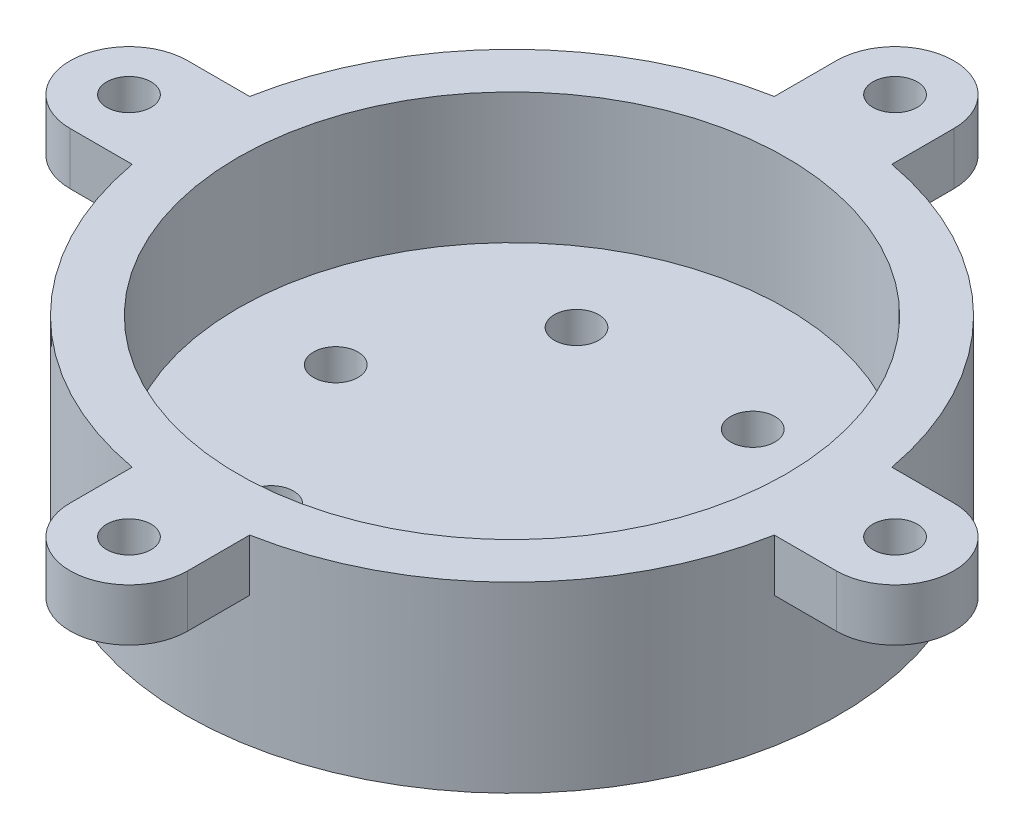
ISO-10303-21;
HEADER;
FILE_DESCRIPTION(('STEP AP214'),'2;1');
FILE_NAME('part.step','',(''),(''),'','','');
FILE_SCHEMA(('AUTOMOTIVE_DESIGN { 1 0 10303 214 1 1 1 1 }'));
ENDSEC;
DATA;
#1=APPLICATION_CONTEXT('core data for automotive mechanical design processes');
#2=APPLICATION_PROTOCOL_DEFINITION('international standard','automotive_design',2000,#1);
#3=PRODUCT_CONTEXT('',#1,'mechanical');
#4=PRODUCT('Part','Part','',(#3));
#5=PRODUCT_RELATED_PRODUCT_CATEGORY('part','',(#4));
#6=PRODUCT_DEFINITION_FORMATION('','',#4);
#7=PRODUCT_DEFINITION_CONTEXT('part definition',#1,'design');
#8=PRODUCT_DEFINITION('design','',#6,#7);
#9=PRODUCT_DEFINITION_SHAPE('','',#8);
#10=(LENGTH_UNIT() NAMED_UNIT(*) SI_UNIT(.MILLI.,.METRE.));
#11=(NAMED_UNIT(*) PLANE_ANGLE_UNIT() SI_UNIT($,.RADIAN.));
#12=(NAMED_UNIT(*) SI_UNIT($,.STERADIAN.) SOLID_ANGLE_UNIT());
#13=UNCERTAINTY_MEASURE_WITH_UNIT(LENGTH_MEASURE(1.E-05),#10,'distance_accuracy_value','');
#14=(GEOMETRIC_REPRESENTATION_CONTEXT(3) GLOBAL_UNCERTAINTY_ASSIGNED_CONTEXT((#13)) GLOBAL_UNIT_ASSIGNED_CONTEXT((#10,
#11,#12)) REPRESENTATION_CONTEXT('',''));
#15=CARTESIAN_POINT('',(0.,0.,0.));
#16=DIRECTION('',(0.,0.,1.));
#17=DIRECTION('',(1.,0.,0.));
#18=AXIS2_PLACEMENT_3D('',#15,#16,#17);
#19=CARTESIAN_POINT('',(0.,6.,0.));
#20=DIRECTION('',(0.,1.,0.));
#21=DIRECTION('',(0.,0.,1.));
#22=AXIS2_PLACEMENT_3D('',#19,#20,#21);
#23=PLANE('',#22);
#24=CARTESIAN_POINT('',(0.,6.,-29.34));
#25=DIRECTION('',(0.,1.,0.));
#26=DIRECTION('',(0.,0.,1.));
#27=AXIS2_PLACEMENT_3D('',#24,#25,#26);
#28=CIRCLE('',#27,4.5);
#29=CARTESIAN_POINT('',(-4.50000000000001,6.,-29.34));
#30=VERTEX_POINT('',#29);
#31=CARTESIAN_POINT('',(4.5,6.,-29.34));
#32=VERTEX_POINT('',#31);
#33=EDGE_CURVE('E234',#30,#32,#28,.F.);
#34=ORIENTED_EDGE('',*,*,#33,.T.);
#35=DIRECTION('',(0.,0.,1.));
#36=VECTOR('',#35,1.);
#37=CARTESIAN_POINT('',(4.5,6.,0.));
#38=LINE('',#37,#36);
#39=CARTESIAN_POINT('',(4.5,6.,-24.5916652547159));
#40=VERTEX_POINT('',#39);
#41=EDGE_CURVE('E242',#32,#40,#38,.T.);
#42=ORIENTED_EDGE('',*,*,#41,.T.);
#43=CARTESIAN_POINT('',(0.,6.,0.));
#44=DIRECTION('',(0.,1.,0.));
#45=DIRECTION('',(0.,0.,1.));
#46=AXIS2_PLACEMENT_3D('',#43,#44,#45);
#47=CIRCLE('',#46,25.);
#48=CARTESIAN_POINT('',(-4.5,6.,-24.5916652547159));
#49=VERTEX_POINT('',#48);
#50=EDGE_CURVE('E240',#40,#49,#47,.T.);
#51=ORIENTED_EDGE('',*,*,#50,.T.);
#52=DIRECTION('',(0.,0.,-1.));
#53=VECTOR('',#52,1.);
#54=CARTESIAN_POINT('',(-4.5,6.,0.));
#55=LINE('',#54,#53);
#56=EDGE_CURVE('E237',#49,#30,#55,.T.);
#57=ORIENTED_EDGE('',*,*,#56,.T.);
#58=EDGE_LOOP('',(#34,#42,#51,#57));
#59=FACE_BOUND('',#58,.T.);
#60=CARTESIAN_POINT('',(0.,6.,-29.34));
#61=DIRECTION('',(0.,-1.,0.));
#62=DIRECTION('',(0.,0.,-1.));
#63=AXIS2_PLACEMENT_3D('',#60,#61,#62);
#64=CIRCLE('',#63,1.725);
#65=CARTESIAN_POINT('',(0.,6.,-31.065));
#66=VERTEX_POINT('',#65);
#67=EDGE_CURVE('E724',#66,#66,#64,.T.);
#68=ORIENTED_EDGE('',*,*,#67,.F.);
#69=EDGE_LOOP('',(#68));
#70=FACE_BOUND('',#69,.T.);
#71=ADVANCED_FACE('F51',(#59,#70),#23,.F.);
#72=CARTESIAN_POINT('',(0.,6.,0.));
#73=DIRECTION('',(0.,1.,0.));
#74=DIRECTION('',(0.,0.,1.));
#75=AXIS2_PLACEMENT_3D('',#72,#73,#74);
#76=PLANE('',#75);
#77=CARTESIAN_POINT('',(0.,6.,0.));
#78=DIRECTION('',(0.,1.,0.));
#79=DIRECTION('',(0.,0.,1.));
#80=AXIS2_PLACEMENT_3D('',#77,#78,#79);
#81=CIRCLE('',#80,25.);
#82=CARTESIAN_POINT('',(-24.5916652547159,6.,-4.5));
#83=VERTEX_POINT('',#82);
#84=CARTESIAN_POINT('',(-24.5916652547159,6.,4.5));
#85=VERTEX_POINT('',#84);
#86=EDGE_CURVE('E170',#83,#85,#81,.T.);
#87=ORIENTED_EDGE('',*,*,#86,.T.);
#88=DIRECTION('',(-1.,0.,0.));
#89=VECTOR('',#88,1.);
#90=CARTESIAN_POINT('',(0.,6.,4.49999999999999));
#91=LINE('',#90,#89);
#92=CARTESIAN_POINT('',(-29.34,6.,4.5));
#93=VERTEX_POINT('',#92);
#94=EDGE_CURVE('E186',#85,#93,#91,.T.);
#95=ORIENTED_EDGE('',*,*,#94,.T.);
#96=CARTESIAN_POINT('',(-29.34,6.,0.));
#97=DIRECTION('',(0.,1.,0.));
#98=DIRECTION('',(0.,0.,1.));
#99=AXIS2_PLACEMENT_3D('',#96,#97,#98);
#100=CIRCLE('',#99,4.5);
#101=CARTESIAN_POINT('',(-29.34,6.,-4.5));
#102=VERTEX_POINT('',#101);
#103=EDGE_CURVE('E172',#93,#102,#100,.F.);
#104=ORIENTED_EDGE('',*,*,#103,.T.);
#105=DIRECTION('',(1.,0.,0.));
#106=VECTOR('',#105,1.);
#107=CARTESIAN_POINT('',(0.,6.,-4.5));
#108=LINE('',#107,#106);
#109=EDGE_CURVE('E165',#102,#83,#108,.T.);
#110=ORIENTED_EDGE('',*,*,#109,.T.);
#111=EDGE_LOOP('',(#87,#95,#104,#110));
#112=FACE_BOUND('',#111,.T.);
#113=CARTESIAN_POINT('',(-29.34,6.,0.));
#114=DIRECTION('',(0.,-1.,0.));
#115=DIRECTION('',(0.,0.,-1.));
#116=AXIS2_PLACEMENT_3D('',#113,#114,#115);
#117=CIRCLE('',#116,1.725);
#118=CARTESIAN_POINT('',(-29.34,6.,-1.725));
#119=VERTEX_POINT('',#118);
#120=EDGE_CURVE('E731',#119,#119,#117,.T.);
#121=ORIENTED_EDGE('',*,*,#120,.F.);
#122=EDGE_LOOP('',(#121));
#123=FACE_BOUND('',#122,.T.);
#124=ADVANCED_FACE('F167',(#112,#123),#76,.F.);
#125=CARTESIAN_POINT('',(0.,6.,0.));
#126=DIRECTION('',(0.,1.,0.));
#127=DIRECTION('',(0.,0.,1.));
#128=AXIS2_PLACEMENT_3D('',#125,#126,#127);
#129=PLANE('',#128);
#130=CARTESIAN_POINT('',(0.,6.,29.34));
#131=DIRECTION('',(0.,1.,0.));
#132=DIRECTION('',(0.,0.,1.));
#133=AXIS2_PLACEMENT_3D('',#130,#131,#132);
#134=CIRCLE('',#133,4.5);
#135=CARTESIAN_POINT('',(4.5,6.,29.34));
#136=VERTEX_POINT('',#135);
#137=CARTESIAN_POINT('',(-4.5,6.,29.34));
#138=VERTEX_POINT('',#137);
#139=EDGE_CURVE('E207',#136,#138,#134,.F.);
#140=ORIENTED_EDGE('',*,*,#139,.T.);
#141=DIRECTION('',(0.,0.,-1.));
#142=VECTOR('',#141,1.);
#143=CARTESIAN_POINT('',(-4.49999999999999,6.,0.));
#144=LINE('',#143,#142);
#145=CARTESIAN_POINT('',(-4.5,6.,24.5916652547159));
#146=VERTEX_POINT('',#145);
#147=EDGE_CURVE('E215',#138,#146,#144,.T.);
#148=ORIENTED_EDGE('',*,*,#147,.T.);
#149=CARTESIAN_POINT('',(0.,6.,0.));
#150=DIRECTION('',(0.,1.,0.));
#151=DIRECTION('',(0.,0.,1.));
#152=AXIS2_PLACEMENT_3D('',#149,#150,#151);
#153=CIRCLE('',#152,25.);
#154=CARTESIAN_POINT('',(4.5,6.,24.5916652547159));
#155=VERTEX_POINT('',#154);
#156=EDGE_CURVE('E213',#146,#155,#153,.T.);
#157=ORIENTED_EDGE('',*,*,#156,.T.);
#158=DIRECTION('',(0.,0.,1.));
#159=VECTOR('',#158,1.);
#160=CARTESIAN_POINT('',(4.5,6.,0.));
#161=LINE('',#160,#159);
#162=EDGE_CURVE('E210',#155,#136,#161,.T.);
#163=ORIENTED_EDGE('',*,*,#162,.T.);
#164=EDGE_LOOP('',(#140,#148,#157,#163));
#165=FACE_BOUND('',#164,.T.);
#166=CARTESIAN_POINT('',(0.,6.,29.34));
#167=DIRECTION('',(0.,-1.,0.));
#168=DIRECTION('',(0.,0.,-1.));
#169=AXIS2_PLACEMENT_3D('',#166,#167,#168);
#170=CIRCLE('',#169,1.725);
#171=CARTESIAN_POINT('',(0.,6.,27.615));
#172=VERTEX_POINT('',#171);
#173=EDGE_CURVE('E740',#172,#172,#170,.T.);
#174=ORIENTED_EDGE('',*,*,#173,.F.);
#175=EDGE_LOOP('',(#174));
#176=FACE_BOUND('',#175,.T.);
#177=ADVANCED_FACE('F323',(#165,#176),#129,.F.);
#178=CARTESIAN_POINT('',(0.,6.,0.));
#179=DIRECTION('',(0.,1.,0.));
#180=DIRECTION('',(0.,0.,1.));
#181=AXIS2_PLACEMENT_3D('',#178,#179,#180);
#182=PLANE('',#181);
#183=CARTESIAN_POINT('',(29.34,6.,0.));
#184=DIRECTION('',(0.,1.,0.));
#185=DIRECTION('',(0.,0.,1.));
#186=AXIS2_PLACEMENT_3D('',#183,#184,#185);
#187=CIRCLE('',#186,4.5);
#188=CARTESIAN_POINT('',(29.34,6.,-4.5));
#189=VERTEX_POINT('',#188);
#190=CARTESIAN_POINT('',(29.34,6.,4.5));
#191=VERTEX_POINT('',#190);
#192=EDGE_CURVE('E262',#189,#191,#187,.F.);
#193=ORIENTED_EDGE('',*,*,#192,.T.);
#194=DIRECTION('',(-1.,0.,0.));
#195=VECTOR('',#194,1.);
#196=CARTESIAN_POINT('',(0.,6.,4.5));
#197=LINE('',#196,#195);
#198=CARTESIAN_POINT('',(24.5916652547159,6.,4.5));
#199=VERTEX_POINT('',#198);
#200=EDGE_CURVE('E270',#191,#199,#197,.T.);
#201=ORIENTED_EDGE('',*,*,#200,.T.);
#202=CARTESIAN_POINT('',(0.,6.,0.));
#203=DIRECTION('',(0.,1.,0.));
#204=DIRECTION('',(0.,0.,1.));
#205=AXIS2_PLACEMENT_3D('',#202,#203,#204);
#206=CIRCLE('',#205,25.);
#207=CARTESIAN_POINT('',(24.5916652547159,6.,-4.5));
#208=VERTEX_POINT('',#207);
#209=EDGE_CURVE('E268',#199,#208,#206,.T.);
#210=ORIENTED_EDGE('',*,*,#209,.T.);
#211=DIRECTION('',(1.,0.,0.));
#212=VECTOR('',#211,1.);
#213=CARTESIAN_POINT('',(0.,6.,-4.5));
#214=LINE('',#213,#212);
#215=EDGE_CURVE('E265',#208,#189,#214,.T.);
#216=ORIENTED_EDGE('',*,*,#215,.T.);
#217=EDGE_LOOP('',(#193,#201,#210,#216));
#218=FACE_BOUND('',#217,.T.);
#219=CARTESIAN_POINT('',(29.34,6.,0.));
#220=DIRECTION('',(0.,-1.,0.));
#221=DIRECTION('',(0.,0.,-1.));
#222=AXIS2_PLACEMENT_3D('',#219,#220,#221);
#223=CIRCLE('',#222,1.725);
#224=CARTESIAN_POINT('',(29.34,6.,-1.725));
#225=VERTEX_POINT('',#224);
#226=EDGE_CURVE('E474',#225,#225,#223,.T.);
#227=ORIENTED_EDGE('',*,*,#226,.F.);
#228=EDGE_LOOP('',(#227));
#229=FACE_BOUND('',#228,.T.);
#230=ADVANCED_FACE('F343',(#218,#229),#182,.F.);
#231=CARTESIAN_POINT('',(0.,-4.,0.));
#232=DIRECTION('',(0.,1.,0.));
#233=DIRECTION('',(0.,0.,1.));
#234=AXIS2_PLACEMENT_3D('',#231,#232,#233);
#235=PLANE('',#234);
#236=CARTESIAN_POINT('',(-6.75000000000014,-4.,-11.6913429510898));
#237=DIRECTION('',(0.,-1.,0.));
#238=DIRECTION('',(0.,0.,-1.));
#239=AXIS2_PLACEMENT_3D('',#236,#237,#238);
#240=CIRCLE('',#239,1.725);
#241=CARTESIAN_POINT('',(-6.75000000000014,-4.,-13.4163429510898));
#242=VERTEX_POINT('',#241);
#243=EDGE_CURVE('E367',#242,#242,#240,.T.);
#244=ORIENTED_EDGE('',*,*,#243,.F.);
#245=EDGE_LOOP('',(#244));
#246=FACE_BOUND('',#245,.T.);
#247=CARTESIAN_POINT('',(6.74999999999989,-4.,-11.69134295109));
#248=DIRECTION('',(0.,-1.,0.));
#249=DIRECTION('',(0.,0.,-1.));
#250=AXIS2_PLACEMENT_3D('',#247,#248,#249);
#251=CIRCLE('',#250,1.725);
#252=CARTESIAN_POINT('',(6.74999999999989,-4.,-13.41634295109));
#253=VERTEX_POINT('',#252);
#254=EDGE_CURVE('E371',#253,#253,#251,.T.);
#255=ORIENTED_EDGE('',*,*,#254,.F.);
#256=EDGE_LOOP('',(#255));
#257=FACE_BOUND('',#256,.T.);
#258=CARTESIAN_POINT('',(13.5,-4.,0.));
#259=DIRECTION('',(0.,-1.,0.));
#260=DIRECTION('',(0.,0.,-1.));
#261=AXIS2_PLACEMENT_3D('',#258,#259,#260);
#262=CIRCLE('',#261,1.725);
#263=CARTESIAN_POINT('',(13.5,-4.,-1.725));
#264=VERTEX_POINT('',#263);
#265=EDGE_CURVE('E375',#264,#264,#262,.T.);
#266=ORIENTED_EDGE('',*,*,#265,.F.);
#267=EDGE_LOOP('',(#266));
#268=FACE_BOUND('',#267,.T.);
#269=CARTESIAN_POINT('',(6.75000000000006,-4.,11.6913429510899));
#270=DIRECTION('',(0.,-1.,0.));
#271=DIRECTION('',(0.,0.,-1.));
#272=AXIS2_PLACEMENT_3D('',#269,#270,#271);
#273=CIRCLE('',#272,1.725);
#274=CARTESIAN_POINT('',(6.75000000000006,-4.,9.96634295108989));
#275=VERTEX_POINT('',#274);
#276=EDGE_CURVE('E379',#275,#275,#273,.T.);
#277=ORIENTED_EDGE('',*,*,#276,.F.);
#278=EDGE_LOOP('',(#277));
#279=FACE_BOUND('',#278,.T.);
#280=CARTESIAN_POINT('',(-13.5,-4.,0.));
#281=DIRECTION('',(0.,-1.,0.));
#282=DIRECTION('',(0.,0.,-1.));
#283=AXIS2_PLACEMENT_3D('',#280,#281,#282);
#284=CIRCLE('',#283,1.725);
#285=CARTESIAN_POINT('',(-13.5,-4.,-1.725));
#286=VERTEX_POINT('',#285);
#287=EDGE_CURVE('E383',#286,#286,#284,.T.);
#288=ORIENTED_EDGE('',*,*,#287,.F.);
#289=EDGE_LOOP('',(#288));
#290=FACE_BOUND('',#289,.T.);
#291=CARTESIAN_POINT('',(0.,-4.,0.));
#292=DIRECTION('',(0.,1.,0.));
#293=DIRECTION('',(0.,0.,1.));
#294=AXIS2_PLACEMENT_3D('',#291,#292,#293);
#295=CIRCLE('',#294,25.);
#296=CARTESIAN_POINT('',(0.,-4.,25.));
#297=VERTEX_POINT('',#296);
#298=EDGE_CURVE('E282',#297,#297,#295,.T.);
#299=ORIENTED_EDGE('',*,*,#298,.F.);
#300=EDGE_LOOP('',(#299));
#301=FACE_BOUND('',#300,.T.);
#302=CARTESIAN_POINT('',(-6.74999999999997,-4.,11.6913429510899));
#303=DIRECTION('',(0.,-1.,0.));
#304=DIRECTION('',(0.,0.,-1.));
#305=AXIS2_PLACEMENT_3D('',#302,#303,#304);
#306=CIRCLE('',#305,1.725);
#307=CARTESIAN_POINT('',(-6.74999999999997,-4.,9.96634295108994));
#308=VERTEX_POINT('',#307);
#309=EDGE_CURVE('E388',#308,#308,#306,.T.);
#310=ORIENTED_EDGE('',*,*,#309,.F.);
#311=EDGE_LOOP('',(#310));
#312=FACE_BOUND('',#311,.T.);
#313=ADVANCED_FACE('F346',(#246,#257,#268,#279,#290,#301,#312),#235,.F.);
#314=CARTESIAN_POINT('',(0.,10.,0.));
#315=DIRECTION('',(0.,-1.,0.));
#316=DIRECTION('',(0.,0.,-1.));
#317=AXIS2_PLACEMENT_3D('',#314,#315,#316);
#318=CYLINDRICAL_SURFACE('',#317,25.);
#319=ORIENTED_EDGE('',*,*,#298,.T.);
#320=EDGE_LOOP('',(#319));
#321=FACE_BOUND('',#320,.T.);
#322=DIRECTION('',(0.,1.,0.));
#323=VECTOR('',#322,1.);
#324=CARTESIAN_POINT('',(-24.5916652547159,6.,4.5));
#325=LINE('',#324,#323);
#326=CARTESIAN_POINT('',(-24.5916652547159,10.,4.5));
#327=VERTEX_POINT('',#326);
#328=EDGE_CURVE('E67',#85,#327,#325,.T.);
#329=ORIENTED_EDGE('',*,*,#328,.F.);
#330=ORIENTED_EDGE('',*,*,#86,.F.);
#331=DIRECTION('',(0.,1.,0.));
#332=VECTOR('',#331,1.);
#333=CARTESIAN_POINT('',(-24.5916652547159,6.,-4.5));
#334=LINE('',#333,#332);
#335=CARTESIAN_POINT('',(-24.5916652547159,10.,-4.5));
#336=VERTEX_POINT('',#335);
#337=EDGE_CURVE('E178',#83,#336,#334,.T.);
#338=ORIENTED_EDGE('',*,*,#337,.T.);
#339=CARTESIAN_POINT('',(0.,10.,0.));
#340=DIRECTION('',(0.,1.,0.));
#341=DIRECTION('',(0.,0.,1.));
#342=AXIS2_PLACEMENT_3D('',#339,#340,#341);
#343=CIRCLE('',#342,25.);
#344=CARTESIAN_POINT('',(-4.5,10.,-24.5916652547159));
#345=VERTEX_POINT('',#344);
#346=EDGE_CURVE('E59',#345,#336,#343,.T.);
#347=ORIENTED_EDGE('',*,*,#346,.F.);
#348=DIRECTION('',(0.,1.,0.));
#349=VECTOR('',#348,1.);
#350=CARTESIAN_POINT('',(-4.5,6.,-24.5916652547159));
#351=LINE('',#350,#349);
#352=EDGE_CURVE('E257',#49,#345,#351,.T.);
#353=ORIENTED_EDGE('',*,*,#352,.F.);
#354=ORIENTED_EDGE('',*,*,#50,.F.);
#355=DIRECTION('',(0.,1.,0.));
#356=VECTOR('',#355,1.);
#357=CARTESIAN_POINT('',(4.5,6.,-24.5916652547159));
#358=LINE('',#357,#356);
#359=CARTESIAN_POINT('',(4.5,10.,-24.5916652547159));
#360=VERTEX_POINT('',#359);
#361=EDGE_CURVE('E254',#40,#360,#358,.T.);
#362=ORIENTED_EDGE('',*,*,#361,.T.);
#363=CARTESIAN_POINT('',(24.5916652547159,10.,-4.5));
#364=VERTEX_POINT('',#363);
#365=EDGE_CURVE('E12',#364,#360,#343,.T.);
#366=ORIENTED_EDGE('',*,*,#365,.F.);
#367=DIRECTION('',(0.,1.,0.));
#368=VECTOR('',#367,1.);
#369=CARTESIAN_POINT('',(24.5916652547159,6.,-4.5));
#370=LINE('',#369,#368);
#371=EDGE_CURVE('E286',#208,#364,#370,.T.);
#372=ORIENTED_EDGE('',*,*,#371,.F.);
#373=ORIENTED_EDGE('',*,*,#209,.F.);
#374=DIRECTION('',(0.,1.,0.));
#375=VECTOR('',#374,1.);
#376=CARTESIAN_POINT('',(24.5916652547159,6.,4.5));
#377=LINE('',#376,#375);
#378=CARTESIAN_POINT('',(24.5916652547159,10.,4.5));
#379=VERTEX_POINT('',#378);
#380=EDGE_CURVE('E283',#199,#379,#377,.T.);
#381=ORIENTED_EDGE('',*,*,#380,.T.);
#382=CARTESIAN_POINT('',(4.5,10.,24.5916652547159));
#383=VERTEX_POINT('',#382);
#384=EDGE_CURVE('E296',#383,#379,#343,.T.);
#385=ORIENTED_EDGE('',*,*,#384,.F.);
#386=DIRECTION('',(0.,1.,0.));
#387=VECTOR('',#386,1.);
#388=CARTESIAN_POINT('',(4.5,6.,24.5916652547159));
#389=LINE('',#388,#387);
#390=EDGE_CURVE('E230',#155,#383,#389,.T.);
#391=ORIENTED_EDGE('',*,*,#390,.F.);
#392=ORIENTED_EDGE('',*,*,#156,.F.);
#393=DIRECTION('',(0.,1.,0.));
#394=VECTOR('',#393,1.);
#395=CARTESIAN_POINT('',(-4.5,6.,24.5916652547159));
#396=LINE('',#395,#394);
#397=CARTESIAN_POINT('',(-4.5,10.,24.5916652547159));
#398=VERTEX_POINT('',#397);
#399=EDGE_CURVE('E227',#146,#398,#396,.T.);
#400=ORIENTED_EDGE('',*,*,#399,.T.);
#401=EDGE_CURVE('E60',#327,#398,#343,.T.);
#402=ORIENTED_EDGE('',*,*,#401,.F.);
#403=EDGE_LOOP('',(#329,#330,#338,#347,#353,#354,#362,#366,#372,#373,#381,#385,#391,#392,#400,#402));
#404=FACE_BOUND('',#403,.T.);
#405=ADVANCED_FACE('F53',(#321,#404),#318,.T.);
#406=CARTESIAN_POINT('',(0.,10.,0.));
#407=DIRECTION('',(0.,1.,0.));
#408=DIRECTION('',(0.,0.,1.));
#409=AXIS2_PLACEMENT_3D('',#406,#407,#408);
#410=PLANE('',#409);
#411=CARTESIAN_POINT('',(0.,10.,-29.34));
#412=DIRECTION('',(0.,1.,0.));
#413=DIRECTION('',(0.,0.,1.));
#414=AXIS2_PLACEMENT_3D('',#411,#412,#413);
#415=CIRCLE('',#414,1.69999999999999);
#416=CARTESIAN_POINT('',(0.,10.,-27.64));
#417=VERTEX_POINT('',#416);
#418=EDGE_CURVE('E726',#417,#417,#415,.T.);
#419=ORIENTED_EDGE('',*,*,#418,.F.);
#420=EDGE_LOOP('',(#419));
#421=FACE_BOUND('',#420,.T.);
#422=CARTESIAN_POINT('',(-29.34,10.,0.));
#423=DIRECTION('',(0.,1.,0.));
#424=DIRECTION('',(0.,0.,1.));
#425=AXIS2_PLACEMENT_3D('',#422,#423,#424);
#426=CIRCLE('',#425,1.69999999999999);
#427=CARTESIAN_POINT('',(-29.34,10.,1.7));
#428=VERTEX_POINT('',#427);
#429=EDGE_CURVE('E737',#428,#428,#426,.T.);
#430=ORIENTED_EDGE('',*,*,#429,.F.);
#431=EDGE_LOOP('',(#430));
#432=FACE_BOUND('',#431,.T.);
#433=CARTESIAN_POINT('',(0.,10.,29.34));
#434=DIRECTION('',(0.,1.,0.));
#435=DIRECTION('',(0.,0.,1.));
#436=AXIS2_PLACEMENT_3D('',#433,#434,#435);
#437=CIRCLE('',#436,1.69999999999999);
#438=CARTESIAN_POINT('',(0.,10.,31.04));
#439=VERTEX_POINT('',#438);
#440=EDGE_CURVE('E477',#439,#439,#437,.T.);
#441=ORIENTED_EDGE('',*,*,#440,.F.);
#442=EDGE_LOOP('',(#441));
#443=FACE_BOUND('',#442,.T.);
#444=CARTESIAN_POINT('',(29.34,10.,0.));
#445=DIRECTION('',(0.,1.,0.));
#446=DIRECTION('',(0.,0.,1.));
#447=AXIS2_PLACEMENT_3D('',#444,#445,#446);
#448=CIRCLE('',#447,1.69999999999999);
#449=CARTESIAN_POINT('',(29.34,10.,1.69999999999999));
#450=VERTEX_POINT('',#449);
#451=EDGE_CURVE('E480',#450,#450,#448,.T.);
#452=ORIENTED_EDGE('',*,*,#451,.F.);
#453=EDGE_LOOP('',(#452));
#454=FACE_BOUND('',#453,.T.);
#455=ORIENTED_EDGE('',*,*,#365,.T.);
#456=DIRECTION('',(0.,0.,1.));
#457=VECTOR('',#456,1.);
#458=CARTESIAN_POINT('',(4.5,10.,0.));
#459=LINE('',#458,#457);
#460=CARTESIAN_POINT('',(4.5,10.,-29.34));
#461=VERTEX_POINT('',#460);
#462=EDGE_CURVE('E238',#461,#360,#459,.T.);
#463=ORIENTED_EDGE('',*,*,#462,.F.);
#464=CARTESIAN_POINT('',(0.,10.,-29.34));
#465=DIRECTION('',(0.,1.,0.));
#466=DIRECTION('',(0.,0.,1.));
#467=AXIS2_PLACEMENT_3D('',#464,#465,#466);
#468=CIRCLE('',#467,4.5);
#469=CARTESIAN_POINT('',(-4.50000000000001,10.,-29.34));
#470=VERTEX_POINT('',#469);
#471=EDGE_CURVE('E226',#470,#461,#468,.F.);
#472=ORIENTED_EDGE('',*,*,#471,.F.);
#473=DIRECTION('',(0.,0.,-1.));
#474=VECTOR('',#473,1.);
#475=CARTESIAN_POINT('',(-4.5,10.,0.));
#476=LINE('',#475,#474);
#477=EDGE_CURVE('E247',#345,#470,#476,.T.);
#478=ORIENTED_EDGE('',*,*,#477,.F.);
#479=ORIENTED_EDGE('',*,*,#346,.T.);
#480=DIRECTION('',(1.,0.,0.));
#481=VECTOR('',#480,1.);
#482=CARTESIAN_POINT('',(0.,10.,-4.5));
#483=LINE('',#482,#481);
#484=CARTESIAN_POINT('',(-29.34,10.,-4.5));
#485=VERTEX_POINT('',#484);
#486=EDGE_CURVE('E181',#485,#336,#483,.T.);
#487=ORIENTED_EDGE('',*,*,#486,.F.);
#488=CARTESIAN_POINT('',(-29.34,10.,0.));
#489=DIRECTION('',(0.,1.,0.));
#490=DIRECTION('',(0.,0.,1.));
#491=AXIS2_PLACEMENT_3D('',#488,#489,#490);
#492=CIRCLE('',#491,4.5);
#493=CARTESIAN_POINT('',(-29.34,10.,4.5));
#494=VERTEX_POINT('',#493);
#495=EDGE_CURVE('E191',#494,#485,#492,.F.);
#496=ORIENTED_EDGE('',*,*,#495,.F.);
#497=DIRECTION('',(-1.,0.,0.));
#498=VECTOR('',#497,1.);
#499=CARTESIAN_POINT('',(0.,10.,4.49999999999999));
#500=LINE('',#499,#498);
#501=EDGE_CURVE('E189',#327,#494,#500,.T.);
#502=ORIENTED_EDGE('',*,*,#501,.F.);
#503=ORIENTED_EDGE('',*,*,#401,.T.);
#504=DIRECTION('',(0.,0.,-1.));
#505=VECTOR('',#504,1.);
#506=CARTESIAN_POINT('',(-4.49999999999999,10.,0.));
#507=LINE('',#506,#505);
#508=CARTESIAN_POINT('',(-4.5,10.,29.34));
#509=VERTEX_POINT('',#508);
#510=EDGE_CURVE('E211',#509,#398,#507,.T.);
#511=ORIENTED_EDGE('',*,*,#510,.F.);
#512=CARTESIAN_POINT('',(0.,10.,29.34));
#513=DIRECTION('',(0.,1.,0.));
#514=DIRECTION('',(0.,0.,1.));
#515=AXIS2_PLACEMENT_3D('',#512,#513,#514);
#516=CIRCLE('',#515,4.5);
#517=CARTESIAN_POINT('',(4.5,10.,29.34));
#518=VERTEX_POINT('',#517);
#519=EDGE_CURVE('E202',#518,#509,#516,.F.);
#520=ORIENTED_EDGE('',*,*,#519,.F.);
#521=DIRECTION('',(0.,0.,1.));
#522=VECTOR('',#521,1.);
#523=CARTESIAN_POINT('',(4.5,10.,0.));
#524=LINE('',#523,#522);
#525=EDGE_CURVE('E75',#383,#518,#524,.T.);
#526=ORIENTED_EDGE('',*,*,#525,.F.);
#527=ORIENTED_EDGE('',*,*,#384,.T.);
#528=DIRECTION('',(-1.,0.,0.));
#529=VECTOR('',#528,1.);
#530=CARTESIAN_POINT('',(0.,10.,4.5));
#531=LINE('',#530,#529);
#532=CARTESIAN_POINT('',(29.34,10.,4.5));
#533=VERTEX_POINT('',#532);
#534=EDGE_CURVE('E266',#533,#379,#531,.T.);
#535=ORIENTED_EDGE('',*,*,#534,.F.);
#536=CARTESIAN_POINT('',(29.34,10.,0.));
#537=DIRECTION('',(0.,1.,0.));
#538=DIRECTION('',(0.,0.,1.));
#539=AXIS2_PLACEMENT_3D('',#536,#537,#538);
#540=CIRCLE('',#539,4.5);
#541=CARTESIAN_POINT('',(29.34,10.,-4.5));
#542=VERTEX_POINT('',#541);
#543=EDGE_CURVE('E253',#542,#533,#540,.F.);
#544=ORIENTED_EDGE('',*,*,#543,.F.);
#545=DIRECTION('',(1.,0.,0.));
#546=VECTOR('',#545,1.);
#547=CARTESIAN_POINT('',(0.,10.,-4.5));
#548=LINE('',#547,#546);
#549=EDGE_CURVE('E275',#364,#542,#548,.T.);
#550=ORIENTED_EDGE('',*,*,#549,.F.);
#551=EDGE_LOOP('',(#455,#463,#472,#478,#479,#487,#496,#502,#503,#511,#520,#526,#527,#535,#544,#550));
#552=FACE_BOUND('',#551,.T.);
#553=CARTESIAN_POINT('',(0.,10.,0.));
#554=DIRECTION('',(0.,1.,0.));
#555=DIRECTION('',(1.,0.,0.));
#556=AXIS2_PLACEMENT_3D('',#553,#554,#555);
#557=CIRCLE('',#556,21.);
#558=CARTESIAN_POINT('',(21.,10.,0.));
#559=VERTEX_POINT('',#558);
#560=EDGE_CURVE('E294',#559,#559,#557,.T.);
#561=ORIENTED_EDGE('',*,*,#560,.F.);
#562=EDGE_LOOP('',(#561));
#563=FACE_BOUND('',#562,.T.);
#564=ADVANCED_FACE('F304',(#421,#432,#443,#454,#552,#563),#410,.T.);
#565=CARTESIAN_POINT('',(0.,10.,0.));
#566=DIRECTION('',(0.,-1.,0.));
#567=DIRECTION('',(0.,0.,-1.));
#568=AXIS2_PLACEMENT_3D('',#565,#566,#567);
#569=CYLINDRICAL_SURFACE('',#568,21.);
#570=ORIENTED_EDGE('',*,*,#560,.T.);
#571=EDGE_LOOP('',(#570));
#572=FACE_BOUND('',#571,.T.);
#573=CARTESIAN_POINT('',(0.,0.,0.));
#574=DIRECTION('',(0.,1.,0.));
#575=DIRECTION('',(1.,0.,0.));
#576=AXIS2_PLACEMENT_3D('',#573,#574,#575);
#577=CIRCLE('',#576,21.);
#578=CARTESIAN_POINT('',(21.,0.,0.));
#579=VERTEX_POINT('',#578);
#580=EDGE_CURVE('E293',#579,#579,#577,.T.);
#581=ORIENTED_EDGE('',*,*,#580,.F.);
#582=EDGE_LOOP('',(#581));
#583=FACE_BOUND('',#582,.T.);
#584=ADVANCED_FACE('F302',(#572,#583),#569,.F.);
#585=CARTESIAN_POINT('',(0.,0.,0.));
#586=DIRECTION('',(0.,1.,0.));
#587=DIRECTION('',(0.,0.,1.));
#588=AXIS2_PLACEMENT_3D('',#585,#586,#587);
#589=PLANE('',#588);
#590=CARTESIAN_POINT('',(-6.75000000000014,0.,-11.6913429510898));
#591=DIRECTION('',(0.,1.,0.));
#592=DIRECTION('',(0.,0.,1.));
#593=AXIS2_PLACEMENT_3D('',#590,#591,#592);
#594=CIRCLE('',#593,1.69999999999999);
#595=CARTESIAN_POINT('',(-6.75000000000014,0.,-9.99134295108985));
#596=VERTEX_POINT('',#595);
#597=EDGE_CURVE('E493',#596,#596,#594,.T.);
#598=ORIENTED_EDGE('',*,*,#597,.F.);
#599=EDGE_LOOP('',(#598));
#600=FACE_BOUND('',#599,.T.);
#601=CARTESIAN_POINT('',(6.74999999999989,0.,-11.69134295109));
#602=DIRECTION('',(0.,1.,0.));
#603=DIRECTION('',(0.,0.,1.));
#604=AXIS2_PLACEMENT_3D('',#601,#602,#603);
#605=CIRCLE('',#604,1.69999999999999);
#606=CARTESIAN_POINT('',(6.74999999999989,0.,-9.99134295108999));
#607=VERTEX_POINT('',#606);
#608=EDGE_CURVE('E500',#607,#607,#605,.T.);
#609=ORIENTED_EDGE('',*,*,#608,.F.);
#610=EDGE_LOOP('',(#609));
#611=FACE_BOUND('',#610,.T.);
#612=CARTESIAN_POINT('',(13.5,0.,0.));
#613=DIRECTION('',(0.,1.,0.));
#614=DIRECTION('',(0.,0.,1.));
#615=AXIS2_PLACEMENT_3D('',#612,#613,#614);
#616=CIRCLE('',#615,1.69999999999999);
#617=CARTESIAN_POINT('',(13.5,0.,1.69999999999999));
#618=VERTEX_POINT('',#617);
#619=EDGE_CURVE('E507',#618,#618,#616,.T.);
#620=ORIENTED_EDGE('',*,*,#619,.F.);
#621=EDGE_LOOP('',(#620));
#622=FACE_BOUND('',#621,.T.);
#623=CARTESIAN_POINT('',(6.75000000000006,0.,11.6913429510899));
#624=DIRECTION('',(0.,1.,0.));
#625=DIRECTION('',(0.,0.,1.));
#626=AXIS2_PLACEMENT_3D('',#623,#624,#625);
#627=CIRCLE('',#626,1.69999999999999);
#628=CARTESIAN_POINT('',(6.75000000000006,0.,13.3913429510899));
#629=VERTEX_POINT('',#628);
#630=EDGE_CURVE('E391',#629,#629,#627,.T.);
#631=ORIENTED_EDGE('',*,*,#630,.F.);
#632=EDGE_LOOP('',(#631));
#633=FACE_BOUND('',#632,.T.);
#634=CARTESIAN_POINT('',(-6.74999999999997,0.,11.6913429510899));
#635=DIRECTION('',(0.,1.,0.));
#636=DIRECTION('',(0.,0.,1.));
#637=AXIS2_PLACEMENT_3D('',#634,#635,#636);
#638=CIRCLE('',#637,1.69999999999999);
#639=CARTESIAN_POINT('',(-6.74999999999997,0.,13.3913429510899));
#640=VERTEX_POINT('',#639);
#641=EDGE_CURVE('E394',#640,#640,#638,.T.);
#642=ORIENTED_EDGE('',*,*,#641,.F.);
#643=EDGE_LOOP('',(#642));
#644=FACE_BOUND('',#643,.T.);
#645=CARTESIAN_POINT('',(-13.5,0.,0.));
#646=DIRECTION('',(0.,1.,0.));
#647=DIRECTION('',(0.,0.,1.));
#648=AXIS2_PLACEMENT_3D('',#645,#646,#647);
#649=CIRCLE('',#648,1.69999999999999);
#650=CARTESIAN_POINT('',(-13.5,0.,1.69999999999999));
#651=VERTEX_POINT('',#650);
#652=EDGE_CURVE('E194',#651,#651,#649,.T.);
#653=ORIENTED_EDGE('',*,*,#652,.F.);
#654=EDGE_LOOP('',(#653));
#655=FACE_BOUND('',#654,.T.);
#656=ORIENTED_EDGE('',*,*,#580,.T.);
#657=EDGE_LOOP('',(#656));
#658=FACE_BOUND('',#657,.T.);
#659=ADVANCED_FACE('F300',(#600,#611,#622,#633,#644,#655,#658),#589,.T.);
#660=CARTESIAN_POINT('',(29.34,6.,0.));
#661=DIRECTION('',(0.,1.,0.));
#662=DIRECTION('',(0.,0.,1.));
#663=AXIS2_PLACEMENT_3D('',#660,#661,#662);
#664=CYLINDRICAL_SURFACE('',#663,4.5);
#665=ORIENTED_EDGE('',*,*,#543,.T.);
#666=DIRECTION('',(0.,1.,0.));
#667=VECTOR('',#666,1.);
#668=CARTESIAN_POINT('',(29.34,6.,4.5));
#669=LINE('',#668,#667);
#670=EDGE_CURVE('E279',#191,#533,#669,.T.);
#671=ORIENTED_EDGE('',*,*,#670,.F.);
#672=ORIENTED_EDGE('',*,*,#192,.F.);
#673=DIRECTION('',(0.,1.,0.));
#674=VECTOR('',#673,1.);
#675=CARTESIAN_POINT('',(29.34,6.,-4.5));
#676=LINE('',#675,#674);
#677=EDGE_CURVE('E272',#189,#542,#676,.T.);
#678=ORIENTED_EDGE('',*,*,#677,.T.);
#679=EDGE_LOOP('',(#665,#671,#672,#678));
#680=FACE_BOUND('',#679,.T.);
#681=ADVANCED_FACE('F311',(#680),#664,.T.);
#682=CARTESIAN_POINT('',(0.,6.,4.5));
#683=DIRECTION('',(0.,0.,-1.));
#684=DIRECTION('',(-1.,0.,0.));
#685=AXIS2_PLACEMENT_3D('',#682,#683,#684);
#686=PLANE('',#685);
#687=ORIENTED_EDGE('',*,*,#534,.T.);
#688=ORIENTED_EDGE('',*,*,#380,.F.);
#689=ORIENTED_EDGE('',*,*,#200,.F.);
#690=ORIENTED_EDGE('',*,*,#670,.T.);
#691=EDGE_LOOP('',(#687,#688,#689,#690));
#692=FACE_BOUND('',#691,.T.);
#693=ADVANCED_FACE('F348',(#692),#686,.F.);
#694=CARTESIAN_POINT('',(0.,6.,-4.5));
#695=DIRECTION('',(0.,0.,1.));
#696=DIRECTION('',(1.,0.,0.));
#697=AXIS2_PLACEMENT_3D('',#694,#695,#696);
#698=PLANE('',#697);
#699=ORIENTED_EDGE('',*,*,#549,.T.);
#700=ORIENTED_EDGE('',*,*,#677,.F.);
#701=ORIENTED_EDGE('',*,*,#215,.F.);
#702=ORIENTED_EDGE('',*,*,#371,.T.);
#703=EDGE_LOOP('',(#699,#700,#701,#702));
#704=FACE_BOUND('',#703,.T.);
#705=ADVANCED_FACE('F341',(#704),#698,.F.);
#706=CARTESIAN_POINT('',(0.,6.,-29.34));
#707=DIRECTION('',(0.,1.,0.));
#708=DIRECTION('',(0.,0.,1.));
#709=AXIS2_PLACEMENT_3D('',#706,#707,#708);
#710=CYLINDRICAL_SURFACE('',#709,4.5);
#711=ORIENTED_EDGE('',*,*,#471,.T.);
#712=DIRECTION('',(0.,1.,0.));
#713=VECTOR('',#712,1.);
#714=CARTESIAN_POINT('',(4.5,6.,-29.34));
#715=LINE('',#714,#713);
#716=EDGE_CURVE('E250',#32,#461,#715,.T.);
#717=ORIENTED_EDGE('',*,*,#716,.F.);
#718=ORIENTED_EDGE('',*,*,#33,.F.);
#719=DIRECTION('',(0.,1.,0.));
#720=VECTOR('',#719,1.);
#721=CARTESIAN_POINT('',(-4.50000000000001,6.,-29.34));
#722=LINE('',#721,#720);
#723=EDGE_CURVE('E244',#30,#470,#722,.T.);
#724=ORIENTED_EDGE('',*,*,#723,.T.);
#725=EDGE_LOOP('',(#711,#717,#718,#724));
#726=FACE_BOUND('',#725,.T.);
#727=ADVANCED_FACE('F334',(#726),#710,.T.);
#728=CARTESIAN_POINT('',(4.5,6.,0.));
#729=DIRECTION('',(-1.,0.,0.));
#730=DIRECTION('',(0.,0.,1.));
#731=AXIS2_PLACEMENT_3D('',#728,#729,#730);
#732=PLANE('',#731);
#733=ORIENTED_EDGE('',*,*,#462,.T.);
#734=ORIENTED_EDGE('',*,*,#361,.F.);
#735=ORIENTED_EDGE('',*,*,#41,.F.);
#736=ORIENTED_EDGE('',*,*,#716,.T.);
#737=EDGE_LOOP('',(#733,#734,#735,#736));
#738=FACE_BOUND('',#737,.T.);
#739=ADVANCED_FACE('F330',(#738),#732,.F.);
#740=CARTESIAN_POINT('',(-4.5,6.,0.));
#741=DIRECTION('',(1.,0.,0.));
#742=DIRECTION('',(0.,0.,-1.));
#743=AXIS2_PLACEMENT_3D('',#740,#741,#742);
#744=PLANE('',#743);
#745=ORIENTED_EDGE('',*,*,#477,.T.);
#746=ORIENTED_EDGE('',*,*,#723,.F.);
#747=ORIENTED_EDGE('',*,*,#56,.F.);
#748=ORIENTED_EDGE('',*,*,#352,.T.);
#749=EDGE_LOOP('',(#745,#746,#747,#748));
#750=FACE_BOUND('',#749,.T.);
#751=ADVANCED_FACE('F333',(#750),#744,.F.);
#752=CARTESIAN_POINT('',(0.,6.,29.34));
#753=DIRECTION('',(0.,1.,0.));
#754=DIRECTION('',(0.,0.,1.));
#755=AXIS2_PLACEMENT_3D('',#752,#753,#754);
#756=CYLINDRICAL_SURFACE('',#755,4.5);
#757=ORIENTED_EDGE('',*,*,#519,.T.);
#758=DIRECTION('',(0.,1.,0.));
#759=VECTOR('',#758,1.);
#760=CARTESIAN_POINT('',(-4.5,6.,29.34));
#761=LINE('',#760,#759);
#762=EDGE_CURVE('E223',#138,#509,#761,.T.);
#763=ORIENTED_EDGE('',*,*,#762,.F.);
#764=ORIENTED_EDGE('',*,*,#139,.F.);
#765=DIRECTION('',(0.,1.,0.));
#766=VECTOR('',#765,1.);
#767=CARTESIAN_POINT('',(4.5,6.,29.34));
#768=LINE('',#767,#766);
#769=EDGE_CURVE('E217',#136,#518,#768,.T.);
#770=ORIENTED_EDGE('',*,*,#769,.T.);
#771=EDGE_LOOP('',(#757,#763,#764,#770));
#772=FACE_BOUND('',#771,.T.);
#773=ADVANCED_FACE('F328',(#772),#756,.T.);
#774=CARTESIAN_POINT('',(-4.49999999999999,6.,0.));
#775=DIRECTION('',(1.,0.,0.));
#776=DIRECTION('',(0.,0.,-1.));
#777=AXIS2_PLACEMENT_3D('',#774,#775,#776);
#778=PLANE('',#777);
#779=ORIENTED_EDGE('',*,*,#510,.T.);
#780=ORIENTED_EDGE('',*,*,#399,.F.);
#781=ORIENTED_EDGE('',*,*,#147,.F.);
#782=ORIENTED_EDGE('',*,*,#762,.T.);
#783=EDGE_LOOP('',(#779,#780,#781,#782));
#784=FACE_BOUND('',#783,.T.);
#785=ADVANCED_FACE('F435',(#784),#778,.F.);
#786=CARTESIAN_POINT('',(4.5,6.,0.));
#787=DIRECTION('',(-1.,0.,0.));
#788=DIRECTION('',(0.,0.,1.));
#789=AXIS2_PLACEMENT_3D('',#786,#787,#788);
#790=PLANE('',#789);
#791=ORIENTED_EDGE('',*,*,#525,.T.);
#792=ORIENTED_EDGE('',*,*,#769,.F.);
#793=ORIENTED_EDGE('',*,*,#162,.F.);
#794=ORIENTED_EDGE('',*,*,#390,.T.);
#795=EDGE_LOOP('',(#791,#792,#793,#794));
#796=FACE_BOUND('',#795,.T.);
#797=ADVANCED_FACE('F428',(#796),#790,.F.);
#798=CARTESIAN_POINT('',(0.,6.,4.49999999999999));
#799=DIRECTION('',(0.,0.,-1.));
#800=DIRECTION('',(-1.,0.,0.));
#801=AXIS2_PLACEMENT_3D('',#798,#799,#800);
#802=PLANE('',#801);
#803=ORIENTED_EDGE('',*,*,#501,.T.);
#804=DIRECTION('',(0.,1.,0.));
#805=VECTOR('',#804,1.);
#806=CARTESIAN_POINT('',(-29.34,6.,4.5));
#807=LINE('',#806,#805);
#808=EDGE_CURVE('E203',#93,#494,#807,.T.);
#809=ORIENTED_EDGE('',*,*,#808,.F.);
#810=ORIENTED_EDGE('',*,*,#94,.F.);
#811=ORIENTED_EDGE('',*,*,#328,.T.);
#812=EDGE_LOOP('',(#803,#809,#810,#811));
#813=FACE_BOUND('',#812,.T.);
#814=ADVANCED_FACE('F425',(#813),#802,.F.);
#815=CARTESIAN_POINT('',(-29.34,6.,0.));
#816=DIRECTION('',(0.,1.,0.));
#817=DIRECTION('',(0.,0.,1.));
#818=AXIS2_PLACEMENT_3D('',#815,#816,#817);
#819=CYLINDRICAL_SURFACE('',#818,4.5);
#820=ORIENTED_EDGE('',*,*,#495,.T.);
#821=DIRECTION('',(0.,1.,0.));
#822=VECTOR('',#821,1.);
#823=CARTESIAN_POINT('',(-29.34,6.,-4.5));
#824=LINE('',#823,#822);
#825=EDGE_CURVE('E185',#102,#485,#824,.T.);
#826=ORIENTED_EDGE('',*,*,#825,.F.);
#827=ORIENTED_EDGE('',*,*,#103,.F.);
#828=ORIENTED_EDGE('',*,*,#808,.T.);
#829=EDGE_LOOP('',(#820,#826,#827,#828));
#830=FACE_BOUND('',#829,.T.);
#831=ADVANCED_FACE('F421',(#830),#819,.T.);
#832=CARTESIAN_POINT('',(0.,6.,-4.5));
#833=DIRECTION('',(0.,0.,1.));
#834=DIRECTION('',(1.,0.,0.));
#835=AXIS2_PLACEMENT_3D('',#832,#833,#834);
#836=PLANE('',#835);
#837=ORIENTED_EDGE('',*,*,#486,.T.);
#838=ORIENTED_EDGE('',*,*,#337,.F.);
#839=ORIENTED_EDGE('',*,*,#109,.F.);
#840=ORIENTED_EDGE('',*,*,#825,.T.);
#841=EDGE_LOOP('',(#837,#838,#839,#840));
#842=FACE_BOUND('',#841,.T.);
#843=ADVANCED_FACE('F179',(#842),#836,.F.);
#844=CARTESIAN_POINT('',(-13.5,-4.,0.));
#845=DIRECTION('',(0.,-1.,0.));
#846=DIRECTION('',(0.,0.,-1.));
#847=AXIS2_PLACEMENT_3D('',#844,#845,#846);
#848=CYLINDRICAL_SURFACE('',#847,1.69999999999999);
#849=CARTESIAN_POINT('',(-13.5,-3.97499999999998,0.));
#850=DIRECTION('',(0.,-1.,0.));
#851=DIRECTION('',(0.,0.,-1.));
#852=AXIS2_PLACEMENT_3D('',#849,#850,#851);
#853=CIRCLE('',#852,1.69999999999999);
#854=CARTESIAN_POINT('',(-13.5,-3.97499999999998,-1.69999999999999));
#855=VERTEX_POINT('',#854);
#856=EDGE_CURVE('E403',#855,#855,#853,.T.);
#857=ORIENTED_EDGE('',*,*,#856,.T.);
#858=EDGE_LOOP('',(#857));
#859=FACE_BOUND('',#858,.T.);
#860=ORIENTED_EDGE('',*,*,#652,.T.);
#861=EDGE_LOOP('',(#860));
#862=FACE_BOUND('',#861,.T.);
#863=ADVANCED_FACE('F410',(#859,#862),#848,.F.);
#864=CARTESIAN_POINT('',(-13.5,-4.,0.));
#865=DIRECTION('',(0.,-1.,0.));
#866=DIRECTION('',(0.,0.,-1.));
#867=AXIS2_PLACEMENT_3D('',#864,#865,#866);
#868=CONICAL_SURFACE('',#867,1.725,0.785398163397171);
#869=ORIENTED_EDGE('',*,*,#856,.F.);
#870=EDGE_LOOP('',(#869));
#871=FACE_BOUND('',#870,.T.);
#872=ORIENTED_EDGE('',*,*,#287,.T.);
#873=EDGE_LOOP('',(#872));
#874=FACE_BOUND('',#873,.T.);
#875=ADVANCED_FACE('F413',(#871,#874),#868,.F.);
#876=CARTESIAN_POINT('',(-6.74999999999997,-4.,11.6913429510899));
#877=DIRECTION('',(0.,-1.,0.));
#878=DIRECTION('',(0.,0.,-1.));
#879=AXIS2_PLACEMENT_3D('',#876,#877,#878);
#880=CYLINDRICAL_SURFACE('',#879,1.69999999999999);
#881=CARTESIAN_POINT('',(-6.74999999999997,-3.97499999999998,11.6913429510899));
#882=DIRECTION('',(0.,-1.,0.));
#883=DIRECTION('',(0.,0.,-1.));
#884=AXIS2_PLACEMENT_3D('',#881,#882,#883);
#885=CIRCLE('',#884,1.69999999999999);
#886=CARTESIAN_POINT('',(-6.74999999999997,-3.97499999999998,9.99134295108995));
#887=VERTEX_POINT('',#886);
#888=EDGE_CURVE('E390',#887,#887,#885,.T.);
#889=ORIENTED_EDGE('',*,*,#888,.T.);
#890=EDGE_LOOP('',(#889));
#891=FACE_BOUND('',#890,.T.);
#892=ORIENTED_EDGE('',*,*,#641,.T.);
#893=EDGE_LOOP('',(#892));
#894=FACE_BOUND('',#893,.T.);
#895=ADVANCED_FACE('F418',(#891,#894),#880,.F.);
#896=CARTESIAN_POINT('',(-6.74999999999997,-4.,11.6913429510899));
#897=DIRECTION('',(0.,-1.,0.));
#898=DIRECTION('',(0.,0.,-1.));
#899=AXIS2_PLACEMENT_3D('',#896,#897,#898);
#900=CONICAL_SURFACE('',#899,1.725,0.785398163397171);
#901=ORIENTED_EDGE('',*,*,#888,.F.);
#902=EDGE_LOOP('',(#901));
#903=FACE_BOUND('',#902,.T.);
#904=ORIENTED_EDGE('',*,*,#309,.T.);
#905=EDGE_LOOP('',(#904));
#906=FACE_BOUND('',#905,.T.);
#907=ADVANCED_FACE('F528',(#903,#906),#900,.F.);
#908=CARTESIAN_POINT('',(6.75000000000006,-4.,11.6913429510899));
#909=DIRECTION('',(0.,-1.,0.));
#910=DIRECTION('',(0.,0.,-1.));
#911=AXIS2_PLACEMENT_3D('',#908,#909,#910);
#912=CYLINDRICAL_SURFACE('',#911,1.69999999999999);
#913=CARTESIAN_POINT('',(6.75000000000006,-3.97499999999998,11.6913429510899));
#914=DIRECTION('',(0.,-1.,0.));
#915=DIRECTION('',(0.,0.,-1.));
#916=AXIS2_PLACEMENT_3D('',#913,#914,#915);
#917=CIRCLE('',#916,1.69999999999999);
#918=CARTESIAN_POINT('',(6.75000000000006,-3.97499999999998,9.99134295108991));
#919=VERTEX_POINT('',#918);
#920=EDGE_CURVE('E397',#919,#919,#917,.T.);
#921=ORIENTED_EDGE('',*,*,#920,.T.);
#922=EDGE_LOOP('',(#921));
#923=FACE_BOUND('',#922,.T.);
#924=ORIENTED_EDGE('',*,*,#630,.T.);
#925=EDGE_LOOP('',(#924));
#926=FACE_BOUND('',#925,.T.);
#927=ADVANCED_FACE('F513',(#923,#926),#912,.F.);
#928=CARTESIAN_POINT('',(6.75000000000006,-4.,11.6913429510899));
#929=DIRECTION('',(0.,-1.,0.));
#930=DIRECTION('',(0.,0.,-1.));
#931=AXIS2_PLACEMENT_3D('',#928,#929,#930);
#932=CONICAL_SURFACE('',#931,1.725,0.785398163397136);
#933=ORIENTED_EDGE('',*,*,#920,.F.);
#934=EDGE_LOOP('',(#933));
#935=FACE_BOUND('',#934,.T.);
#936=ORIENTED_EDGE('',*,*,#276,.T.);
#937=EDGE_LOOP('',(#936));
#938=FACE_BOUND('',#937,.T.);
#939=ADVANCED_FACE('F516',(#935,#938),#932,.F.);
#940=CARTESIAN_POINT('',(13.5,-4.,0.));
#941=DIRECTION('',(0.,-1.,0.));
#942=DIRECTION('',(0.,0.,-1.));
#943=AXIS2_PLACEMENT_3D('',#940,#941,#942);
#944=CYLINDRICAL_SURFACE('',#943,1.69999999999999);
#945=CARTESIAN_POINT('',(13.5,-3.97499999999998,0.));
#946=DIRECTION('',(0.,-1.,0.));
#947=DIRECTION('',(0.,0.,-1.));
#948=AXIS2_PLACEMENT_3D('',#945,#946,#947);
#949=CIRCLE('',#948,1.69999999999999);
#950=CARTESIAN_POINT('',(13.5,-3.97499999999998,-1.69999999999999));
#951=VERTEX_POINT('',#950);
#952=EDGE_CURVE('E504',#951,#951,#949,.T.);
#953=ORIENTED_EDGE('',*,*,#952,.T.);
#954=EDGE_LOOP('',(#953));
#955=FACE_BOUND('',#954,.T.);
#956=ORIENTED_EDGE('',*,*,#619,.T.);
#957=EDGE_LOOP('',(#956));
#958=FACE_BOUND('',#957,.T.);
#959=ADVANCED_FACE('F519',(#955,#958),#944,.F.);
#960=CARTESIAN_POINT('',(13.5,-4.,0.));
#961=DIRECTION('',(0.,-1.,0.));
#962=DIRECTION('',(0.,0.,-1.));
#963=AXIS2_PLACEMENT_3D('',#960,#961,#962);
#964=CONICAL_SURFACE('',#963,1.725,0.785398163397171);
#965=ORIENTED_EDGE('',*,*,#952,.F.);
#966=EDGE_LOOP('',(#965));
#967=FACE_BOUND('',#966,.T.);
#968=ORIENTED_EDGE('',*,*,#265,.T.);
#969=EDGE_LOOP('',(#968));
#970=FACE_BOUND('',#969,.T.);
#971=ADVANCED_FACE('F525',(#967,#970),#964,.F.);
#972=CARTESIAN_POINT('',(6.74999999999989,-4.,-11.69134295109));
#973=DIRECTION('',(0.,-1.,0.));
#974=DIRECTION('',(0.,0.,-1.));
#975=AXIS2_PLACEMENT_3D('',#972,#973,#974);
#976=CYLINDRICAL_SURFACE('',#975,1.69999999999999);
#977=CARTESIAN_POINT('',(6.74999999999989,-3.97499999999998,-11.69134295109));
#978=DIRECTION('',(0.,-1.,0.));
#979=DIRECTION('',(0.,0.,-1.));
#980=AXIS2_PLACEMENT_3D('',#977,#978,#979);
#981=CIRCLE('',#980,1.69999999999999);
#982=CARTESIAN_POINT('',(6.74999999999989,-3.97499999999998,-13.39134295109));
#983=VERTEX_POINT('',#982);
#984=EDGE_CURVE('E497',#983,#983,#981,.T.);
#985=ORIENTED_EDGE('',*,*,#984,.T.);
#986=EDGE_LOOP('',(#985));
#987=FACE_BOUND('',#986,.T.);
#988=ORIENTED_EDGE('',*,*,#608,.T.);
#989=EDGE_LOOP('',(#988));
#990=FACE_BOUND('',#989,.T.);
#991=ADVANCED_FACE('F575',(#987,#990),#976,.F.);
#992=CARTESIAN_POINT('',(6.74999999999989,-4.,-11.69134295109));
#993=DIRECTION('',(0.,-1.,0.));
#994=DIRECTION('',(0.,0.,-1.));
#995=AXIS2_PLACEMENT_3D('',#992,#993,#994);
#996=CONICAL_SURFACE('',#995,1.725,0.785398163397171);
#997=ORIENTED_EDGE('',*,*,#984,.F.);
#998=EDGE_LOOP('',(#997));
#999=FACE_BOUND('',#998,.T.);
#1000=ORIENTED_EDGE('',*,*,#254,.T.);
#1001=EDGE_LOOP('',(#1000));
#1002=FACE_BOUND('',#1001,.T.);
#1003=ADVANCED_FACE('F584',(#999,#1002),#996,.F.);
#1004=CARTESIAN_POINT('',(-6.75000000000014,-4.,-11.6913429510898));
#1005=DIRECTION('',(0.,-1.,0.));
#1006=DIRECTION('',(0.,0.,-1.));
#1007=AXIS2_PLACEMENT_3D('',#1004,#1005,#1006);
#1008=CYLINDRICAL_SURFACE('',#1007,1.69999999999999);
#1009=CARTESIAN_POINT('',(-6.75000000000014,-3.97499999999998,-11.6913429510898));
#1010=DIRECTION('',(0.,-1.,0.));
#1011=DIRECTION('',(0.,0.,-1.));
#1012=AXIS2_PLACEMENT_3D('',#1009,#1010,#1011);
#1013=CIRCLE('',#1012,1.69999999999999);
#1014=CARTESIAN_POINT('',(-6.75000000000014,-3.97499999999998,-13.3913429510898));
#1015=VERTEX_POINT('',#1014);
#1016=EDGE_CURVE('E490',#1015,#1015,#1013,.T.);
#1017=ORIENTED_EDGE('',*,*,#1016,.T.);
#1018=EDGE_LOOP('',(#1017));
#1019=FACE_BOUND('',#1018,.T.);
#1020=ORIENTED_EDGE('',*,*,#597,.T.);
#1021=EDGE_LOOP('',(#1020));
#1022=FACE_BOUND('',#1021,.T.);
#1023=ADVANCED_FACE('F594',(#1019,#1022),#1008,.F.);
#1024=CARTESIAN_POINT('',(-6.75000000000014,-4.,-11.6913429510898));
#1025=DIRECTION('',(0.,-1.,0.));
#1026=DIRECTION('',(0.,0.,-1.));
#1027=AXIS2_PLACEMENT_3D('',#1024,#1025,#1026);
#1028=CONICAL_SURFACE('',#1027,1.725,0.785398163397171);
#1029=ORIENTED_EDGE('',*,*,#1016,.F.);
#1030=EDGE_LOOP('',(#1029));
#1031=FACE_BOUND('',#1030,.T.);
#1032=ORIENTED_EDGE('',*,*,#243,.T.);
#1033=EDGE_LOOP('',(#1032));
#1034=FACE_BOUND('',#1033,.T.);
#1035=ADVANCED_FACE('F604',(#1031,#1034),#1028,.F.);
#1036=CARTESIAN_POINT('',(29.34,6.,0.));
#1037=DIRECTION('',(0.,-1.,0.));
#1038=DIRECTION('',(0.,0.,-1.));
#1039=AXIS2_PLACEMENT_3D('',#1036,#1037,#1038);
#1040=CYLINDRICAL_SURFACE('',#1039,1.69999999999999);
#1041=CARTESIAN_POINT('',(29.34,6.02500000000003,0.));
#1042=DIRECTION('',(0.,-1.,0.));
#1043=DIRECTION('',(0.,0.,-1.));
#1044=AXIS2_PLACEMENT_3D('',#1041,#1042,#1043);
#1045=CIRCLE('',#1044,1.69999999999999);
#1046=CARTESIAN_POINT('',(29.34,6.02500000000003,-1.69999999999999));
#1047=VERTEX_POINT('',#1046);
#1048=EDGE_CURVE('E476',#1047,#1047,#1045,.T.);
#1049=ORIENTED_EDGE('',*,*,#1048,.T.);
#1050=EDGE_LOOP('',(#1049));
#1051=FACE_BOUND('',#1050,.T.);
#1052=ORIENTED_EDGE('',*,*,#451,.T.);
#1053=EDGE_LOOP('',(#1052));
#1054=FACE_BOUND('',#1053,.T.);
#1055=ADVANCED_FACE('F613',(#1051,#1054),#1040,.F.);
#1056=CARTESIAN_POINT('',(29.34,6.,0.));
#1057=DIRECTION('',(0.,-1.,0.));
#1058=DIRECTION('',(0.,0.,-1.));
#1059=AXIS2_PLACEMENT_3D('',#1056,#1057,#1058);
#1060=CONICAL_SURFACE('',#1059,1.725,0.785398163397136);
#1061=ORIENTED_EDGE('',*,*,#1048,.F.);
#1062=EDGE_LOOP('',(#1061));
#1063=FACE_BOUND('',#1062,.T.);
#1064=ORIENTED_EDGE('',*,*,#226,.T.);
#1065=EDGE_LOOP('',(#1064));
#1066=FACE_BOUND('',#1065,.T.);
#1067=ADVANCED_FACE('F645',(#1063,#1066),#1060,.F.);
#1068=CARTESIAN_POINT('',(0.,6.,29.34));
#1069=DIRECTION('',(0.,-1.,0.));
#1070=DIRECTION('',(0.,0.,-1.));
#1071=AXIS2_PLACEMENT_3D('',#1068,#1069,#1070);
#1072=CYLINDRICAL_SURFACE('',#1071,1.69999999999999);
#1073=CARTESIAN_POINT('',(0.,6.02500000000003,29.34));
#1074=DIRECTION('',(0.,-1.,0.));
#1075=DIRECTION('',(0.,0.,-1.));
#1076=AXIS2_PLACEMENT_3D('',#1073,#1074,#1075);
#1077=CIRCLE('',#1076,1.69999999999999);
#1078=CARTESIAN_POINT('',(0.,6.02500000000003,27.64));
#1079=VERTEX_POINT('',#1078);
#1080=EDGE_CURVE('E483',#1079,#1079,#1077,.T.);
#1081=ORIENTED_EDGE('',*,*,#1080,.T.);
#1082=EDGE_LOOP('',(#1081));
#1083=FACE_BOUND('',#1082,.T.);
#1084=ORIENTED_EDGE('',*,*,#440,.T.);
#1085=EDGE_LOOP('',(#1084));
#1086=FACE_BOUND('',#1085,.T.);
#1087=ADVANCED_FACE('F655',(#1083,#1086),#1072,.F.);
#1088=CARTESIAN_POINT('',(0.,6.,29.34));
#1089=DIRECTION('',(0.,-1.,0.));
#1090=DIRECTION('',(0.,0.,-1.));
#1091=AXIS2_PLACEMENT_3D('',#1088,#1089,#1090);
#1092=CONICAL_SURFACE('',#1091,1.725,0.785398163397171);
#1093=ORIENTED_EDGE('',*,*,#1080,.F.);
#1094=EDGE_LOOP('',(#1093));
#1095=FACE_BOUND('',#1094,.T.);
#1096=ORIENTED_EDGE('',*,*,#173,.T.);
#1097=EDGE_LOOP('',(#1096));
#1098=FACE_BOUND('',#1097,.T.);
#1099=ADVANCED_FACE('F665',(#1095,#1098),#1092,.F.);
#1100=CARTESIAN_POINT('',(-29.34,6.,0.));
#1101=DIRECTION('',(0.,-1.,0.));
#1102=DIRECTION('',(0.,0.,-1.));
#1103=AXIS2_PLACEMENT_3D('',#1100,#1101,#1102);
#1104=CYLINDRICAL_SURFACE('',#1103,1.69999999999999);
#1105=CARTESIAN_POINT('',(-29.34,6.02500000000003,0.));
#1106=DIRECTION('',(0.,-1.,0.));
#1107=DIRECTION('',(0.,0.,-1.));
#1108=AXIS2_PLACEMENT_3D('',#1105,#1106,#1107);
#1109=CIRCLE('',#1108,1.69999999999999);
#1110=CARTESIAN_POINT('',(-29.34,6.02500000000003,-1.69999999999999));
#1111=VERTEX_POINT('',#1110);
#1112=EDGE_CURVE('E734',#1111,#1111,#1109,.T.);
#1113=ORIENTED_EDGE('',*,*,#1112,.T.);
#1114=EDGE_LOOP('',(#1113));
#1115=FACE_BOUND('',#1114,.T.);
#1116=ORIENTED_EDGE('',*,*,#429,.T.);
#1117=EDGE_LOOP('',(#1116));
#1118=FACE_BOUND('',#1117,.T.);
#1119=ADVANCED_FACE('F675',(#1115,#1118),#1104,.F.);
#1120=CARTESIAN_POINT('',(-29.34,6.,0.));
#1121=DIRECTION('',(0.,-1.,0.));
#1122=DIRECTION('',(0.,0.,-1.));
#1123=AXIS2_PLACEMENT_3D('',#1120,#1121,#1122);
#1124=CONICAL_SURFACE('',#1123,1.725,0.785398163397136);
#1125=ORIENTED_EDGE('',*,*,#1112,.F.);
#1126=EDGE_LOOP('',(#1125));
#1127=FACE_BOUND('',#1126,.T.);
#1128=ORIENTED_EDGE('',*,*,#120,.T.);
#1129=EDGE_LOOP('',(#1128));
#1130=FACE_BOUND('',#1129,.T.);
#1131=ADVANCED_FACE('F685',(#1127,#1130),#1124,.F.);
#1132=CARTESIAN_POINT('',(0.,6.,-29.34));
#1133=DIRECTION('',(0.,-1.,0.));
#1134=DIRECTION('',(0.,0.,-1.));
#1135=AXIS2_PLACEMENT_3D('',#1132,#1133,#1134);
#1136=CYLINDRICAL_SURFACE('',#1135,1.69999999999999);
#1137=CARTESIAN_POINT('',(0.,6.02500000000003,-29.34));
#1138=DIRECTION('',(0.,-1.,0.));
#1139=DIRECTION('',(0.,0.,-1.));
#1140=AXIS2_PLACEMENT_3D('',#1137,#1138,#1139);
#1141=CIRCLE('',#1140,1.69999999999999);
#1142=CARTESIAN_POINT('',(0.,6.02500000000003,-31.04));
#1143=VERTEX_POINT('',#1142);
#1144=EDGE_CURVE('E721',#1143,#1143,#1141,.T.);
#1145=ORIENTED_EDGE('',*,*,#1144,.T.);
#1146=EDGE_LOOP('',(#1145));
#1147=FACE_BOUND('',#1146,.T.);
#1148=ORIENTED_EDGE('',*,*,#418,.T.);
#1149=EDGE_LOOP('',(#1148));
#1150=FACE_BOUND('',#1149,.T.);
#1151=ADVANCED_FACE('F695',(#1147,#1150),#1136,.F.);
#1152=CARTESIAN_POINT('',(0.,6.,-29.34));
#1153=DIRECTION('',(0.,-1.,0.));
#1154=DIRECTION('',(0.,0.,-1.));
#1155=AXIS2_PLACEMENT_3D('',#1152,#1153,#1154);
#1156=CONICAL_SURFACE('',#1155,1.725,0.785398163397171);
#1157=ORIENTED_EDGE('',*,*,#1144,.F.);
#1158=EDGE_LOOP('',(#1157));
#1159=FACE_BOUND('',#1158,.T.);
#1160=ORIENTED_EDGE('',*,*,#67,.T.);
#1161=EDGE_LOOP('',(#1160));
#1162=FACE_BOUND('',#1161,.T.);
#1163=ADVANCED_FACE('F705',(#1159,#1162),#1156,.F.);
#1164=CLOSED_SHELL('',(#71,#124,#177,#230,#313,#405,#564,#584,#659,#681,#693,#705,#727,#739,
#751,#773,#785,#797,#814,#831,#843,#863,#875,#895,#907,#927,#939,#959,#971,#991,#1003,#1023,
#1035,#1055,#1067,#1087,#1099,#1119,#1131,#1151,#1163));
#1165=MANIFOLD_SOLID_BREP('B2',#1164);
#1166=ADVANCED_BREP_SHAPE_REPRESENTATION('',(#18,#1165),#14);
#1167=SHAPE_DEFINITION_REPRESENTATION(#9,#1166);
ENDSEC;
END-ISO-10303-21;
